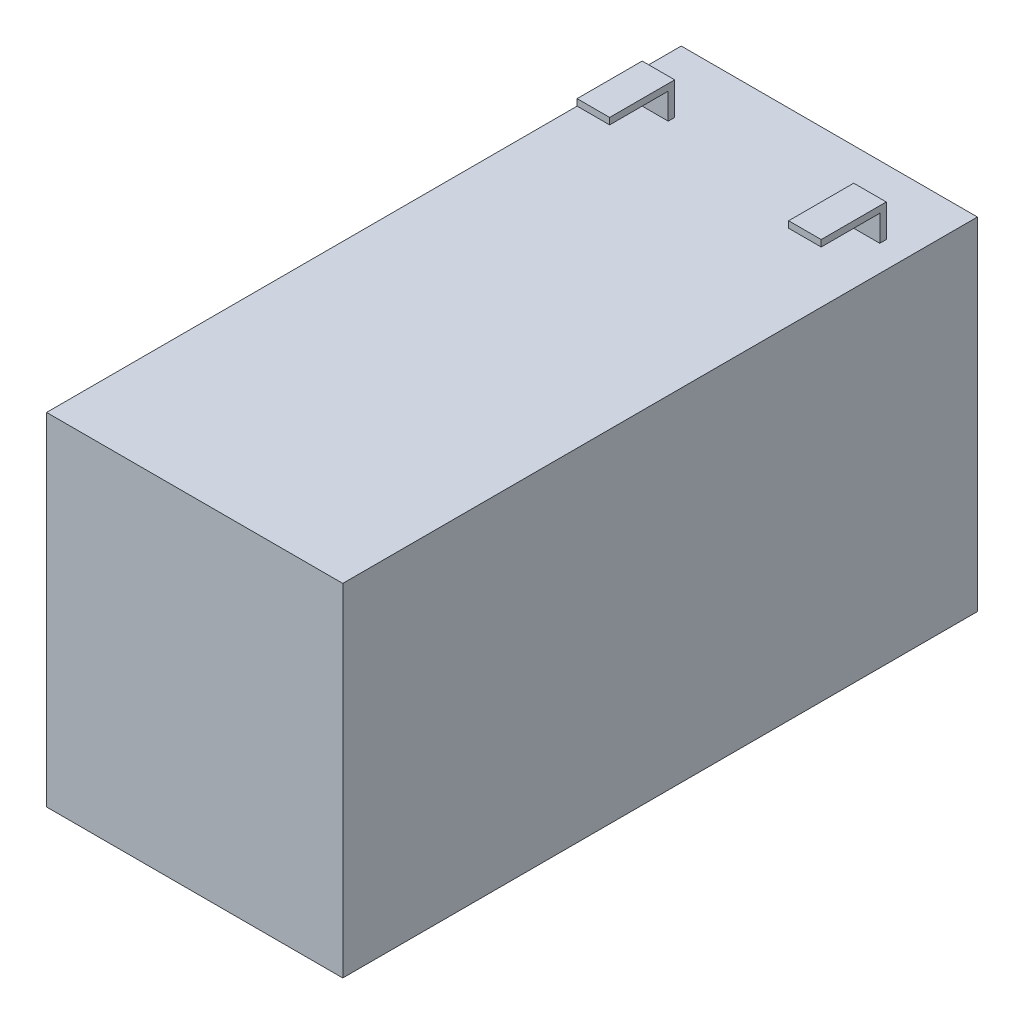
ISO-10303-21;
HEADER;
FILE_DESCRIPTION(('STEP AP214'),'2;1');
FILE_NAME('part.step','',(''),(''),'','','');
FILE_SCHEMA(('AUTOMOTIVE_DESIGN { 1 0 10303 214 1 1 1 1 }'));
ENDSEC;
DATA;
#1=APPLICATION_CONTEXT('core data for automotive mechanical design processes');
#2=APPLICATION_PROTOCOL_DEFINITION('international standard','automotive_design',2000,#1);
#3=PRODUCT_CONTEXT('',#1,'mechanical');
#4=PRODUCT('Part','Part','',(#3));
#5=PRODUCT_RELATED_PRODUCT_CATEGORY('part','',(#4));
#6=PRODUCT_DEFINITION_FORMATION('','',#4);
#7=PRODUCT_DEFINITION_CONTEXT('part definition',#1,'design');
#8=PRODUCT_DEFINITION('design','',#6,#7);
#9=PRODUCT_DEFINITION_SHAPE('','',#8);
#10=(LENGTH_UNIT() NAMED_UNIT(*) SI_UNIT(.MILLI.,.METRE.));
#11=(NAMED_UNIT(*) PLANE_ANGLE_UNIT() SI_UNIT($,.RADIAN.));
#12=(NAMED_UNIT(*) SI_UNIT($,.STERADIAN.) SOLID_ANGLE_UNIT());
#13=UNCERTAINTY_MEASURE_WITH_UNIT(LENGTH_MEASURE(1.E-05),#10,'distance_accuracy_value','');
#14=(GEOMETRIC_REPRESENTATION_CONTEXT(3) GLOBAL_UNCERTAINTY_ASSIGNED_CONTEXT((#13)) GLOBAL_UNIT_ASSIGNED_CONTEXT((#10,
#11,#12)) REPRESENTATION_CONTEXT('',''));
#15=CARTESIAN_POINT('',(0.,0.,0.));
#16=DIRECTION('',(0.,0.,1.));
#17=DIRECTION('',(1.,0.,0.));
#18=AXIS2_PLACEMENT_3D('',#15,#16,#17);
#19=CARTESIAN_POINT('',(-22.75,52.5,-48.75));
#20=DIRECTION('',(0.,-1.,0.));
#21=DIRECTION('',(0.,0.,-1.));
#22=AXIS2_PLACEMENT_3D('',#19,#20,#21);
#23=PLANE('',#22);
#24=DIRECTION('',(1.,0.,0.));
#25=VECTOR('',#24,1.);
#26=CARTESIAN_POINT('',(18.75,52.5,-38.75));
#27=LINE('',#26,#25);
#28=CARTESIAN_POINT('',(13.75,52.5,-38.75));
#29=VERTEX_POINT('',#28);
#30=CARTESIAN_POINT('',(18.75,52.5,-38.75));
#31=VERTEX_POINT('',#30);
#32=EDGE_CURVE('E166',#29,#31,#27,.T.);
#33=ORIENTED_EDGE('',*,*,#32,.T.);
#34=DIRECTION('',(0.,0.,1.));
#35=VECTOR('',#34,1.);
#36=CARTESIAN_POINT('',(18.75,52.5,-38.75));
#37=LINE('',#36,#35);
#38=CARTESIAN_POINT('',(18.75,52.5,-37.75));
#39=VERTEX_POINT('',#38);
#40=EDGE_CURVE('E50',#31,#39,#37,.T.);
#41=ORIENTED_EDGE('',*,*,#40,.T.);
#42=DIRECTION('',(-1.,0.,0.));
#43=VECTOR('',#42,1.);
#44=CARTESIAN_POINT('',(18.75,52.5,-37.75));
#45=LINE('',#44,#43);
#46=CARTESIAN_POINT('',(13.75,52.5,-37.75));
#47=VERTEX_POINT('',#46);
#48=EDGE_CURVE('E172',#39,#47,#45,.T.);
#49=ORIENTED_EDGE('',*,*,#48,.T.);
#50=DIRECTION('',(0.,0.,-1.));
#51=VECTOR('',#50,1.);
#52=CARTESIAN_POINT('',(13.75,52.5,-38.75));
#53=LINE('',#52,#51);
#54=EDGE_CURVE('E154',#47,#29,#53,.T.);
#55=ORIENTED_EDGE('',*,*,#54,.T.);
#56=EDGE_LOOP('',(#33,#41,#49,#55));
#57=FACE_BOUND('',#56,.T.);
#58=DIRECTION('',(0.,0.,1.));
#59=VECTOR('',#58,1.);
#60=CARTESIAN_POINT('',(-22.75,52.5,48.75));
#61=LINE('',#60,#59);
#62=CARTESIAN_POINT('',(-22.75,52.5,-48.75));
#63=VERTEX_POINT('',#62);
#64=CARTESIAN_POINT('',(-22.75,52.5,48.75));
#65=VERTEX_POINT('',#64);
#66=EDGE_CURVE('E249',#63,#65,#61,.T.);
#67=ORIENTED_EDGE('',*,*,#66,.T.);
#68=DIRECTION('',(1.,0.,0.));
#69=VECTOR('',#68,1.);
#70=CARTESIAN_POINT('',(-22.75,52.5,48.75));
#71=LINE('',#70,#69);
#72=CARTESIAN_POINT('',(22.75,52.5,48.75));
#73=VERTEX_POINT('',#72);
#74=EDGE_CURVE('E252',#65,#73,#71,.T.);
#75=ORIENTED_EDGE('',*,*,#74,.T.);
#76=DIRECTION('',(0.,0.,-1.));
#77=VECTOR('',#76,1.);
#78=CARTESIAN_POINT('',(22.75,52.5,48.75));
#79=LINE('',#78,#77);
#80=CARTESIAN_POINT('',(22.75,52.5,-48.75));
#81=VERTEX_POINT('',#80);
#82=EDGE_CURVE('E255',#73,#81,#79,.T.);
#83=ORIENTED_EDGE('',*,*,#82,.T.);
#84=DIRECTION('',(-1.,0.,0.));
#85=VECTOR('',#84,1.);
#86=CARTESIAN_POINT('',(-22.75,52.5,-48.75));
#87=LINE('',#86,#85);
#88=EDGE_CURVE('E257',#81,#63,#87,.T.);
#89=ORIENTED_EDGE('',*,*,#88,.T.);
#90=EDGE_LOOP('',(#67,#75,#83,#89));
#91=FACE_BOUND('',#90,.T.);
#92=DIRECTION('',(-1.,0.,0.));
#93=VECTOR('',#92,1.);
#94=CARTESIAN_POINT('',(-18.75,52.5,-38.75));
#95=LINE('',#94,#93);
#96=CARTESIAN_POINT('',(-13.75,52.5,-38.75));
#97=VERTEX_POINT('',#96);
#98=CARTESIAN_POINT('',(-18.75,52.5,-38.75));
#99=VERTEX_POINT('',#98);
#100=EDGE_CURVE('E58',#97,#99,#95,.T.);
#101=ORIENTED_EDGE('',*,*,#100,.F.);
#102=DIRECTION('',(0.,0.,-1.));
#103=VECTOR('',#102,1.);
#104=CARTESIAN_POINT('',(-13.75,52.5,-38.75));
#105=LINE('',#104,#103);
#106=CARTESIAN_POINT('',(-13.75,52.5,-37.75));
#107=VERTEX_POINT('',#106);
#108=EDGE_CURVE('E222',#107,#97,#105,.T.);
#109=ORIENTED_EDGE('',*,*,#108,.F.);
#110=DIRECTION('',(1.,0.,0.));
#111=VECTOR('',#110,1.);
#112=CARTESIAN_POINT('',(-18.75,52.5,-37.75));
#113=LINE('',#112,#111);
#114=CARTESIAN_POINT('',(-18.75,52.5,-37.75));
#115=VERTEX_POINT('',#114);
#116=EDGE_CURVE('E219',#115,#107,#113,.T.);
#117=ORIENTED_EDGE('',*,*,#116,.F.);
#118=DIRECTION('',(0.,0.,1.));
#119=VECTOR('',#118,1.);
#120=CARTESIAN_POINT('',(-18.75,52.5,-38.75));
#121=LINE('',#120,#119);
#122=EDGE_CURVE('E196',#99,#115,#121,.T.);
#123=ORIENTED_EDGE('',*,*,#122,.F.);
#124=EDGE_LOOP('',(#101,#109,#117,#123));
#125=FACE_BOUND('',#124,.T.);
#126=ADVANCED_FACE('F35',(#57,#91,#125),#23,.F.);
#127=CARTESIAN_POINT('',(-22.75,52.5,48.75));
#128=DIRECTION('',(1.,0.,0.));
#129=DIRECTION('',(0.,0.,-1.));
#130=AXIS2_PLACEMENT_3D('',#127,#128,#129);
#131=PLANE('',#130);
#132=DIRECTION('',(0.,0.,1.));
#133=VECTOR('',#132,1.);
#134=CARTESIAN_POINT('',(-22.75,0.,48.75));
#135=LINE('',#134,#133);
#136=CARTESIAN_POINT('',(-22.75,0.,-48.75));
#137=VERTEX_POINT('',#136);
#138=CARTESIAN_POINT('',(-22.75,0.,48.75));
#139=VERTEX_POINT('',#138);
#140=EDGE_CURVE('E201',#137,#139,#135,.T.);
#141=ORIENTED_EDGE('',*,*,#140,.T.);
#142=DIRECTION('',(0.,-1.,0.));
#143=VECTOR('',#142,1.);
#144=CARTESIAN_POINT('',(-22.75,52.5,48.75));
#145=LINE('',#144,#143);
#146=EDGE_CURVE('E12',#65,#139,#145,.T.);
#147=ORIENTED_EDGE('',*,*,#146,.F.);
#148=ORIENTED_EDGE('',*,*,#66,.F.);
#149=DIRECTION('',(0.,-1.,0.));
#150=VECTOR('',#149,1.);
#151=CARTESIAN_POINT('',(-22.75,52.5,-48.75));
#152=LINE('',#151,#150);
#153=EDGE_CURVE('E259',#63,#137,#152,.T.);
#154=ORIENTED_EDGE('',*,*,#153,.T.);
#155=EDGE_LOOP('',(#141,#147,#148,#154));
#156=FACE_BOUND('',#155,.T.);
#157=ADVANCED_FACE('F37',(#156),#131,.F.);
#158=CARTESIAN_POINT('',(-22.75,52.5,48.75));
#159=DIRECTION('',(0.,0.,-1.));
#160=DIRECTION('',(-1.,0.,0.));
#161=AXIS2_PLACEMENT_3D('',#158,#159,#160);
#162=PLANE('',#161);
#163=DIRECTION('',(1.,0.,0.));
#164=VECTOR('',#163,1.);
#165=CARTESIAN_POINT('',(-22.75,0.,48.75));
#166=LINE('',#165,#164);
#167=CARTESIAN_POINT('',(22.75,0.,48.75));
#168=VERTEX_POINT('',#167);
#169=EDGE_CURVE('E262',#139,#168,#166,.T.);
#170=ORIENTED_EDGE('',*,*,#169,.T.);
#171=DIRECTION('',(0.,-1.,0.));
#172=VECTOR('',#171,1.);
#173=CARTESIAN_POINT('',(22.75,52.5,48.75));
#174=LINE('',#173,#172);
#175=EDGE_CURVE('E43',#73,#168,#174,.T.);
#176=ORIENTED_EDGE('',*,*,#175,.F.);
#177=ORIENTED_EDGE('',*,*,#74,.F.);
#178=ORIENTED_EDGE('',*,*,#146,.T.);
#179=EDGE_LOOP('',(#170,#176,#177,#178));
#180=FACE_BOUND('',#179,.T.);
#181=ADVANCED_FACE('F290',(#180),#162,.F.);
#182=CARTESIAN_POINT('',(22.75,52.5,48.75));
#183=DIRECTION('',(-1.,0.,0.));
#184=DIRECTION('',(0.,0.,1.));
#185=AXIS2_PLACEMENT_3D('',#182,#183,#184);
#186=PLANE('',#185);
#187=DIRECTION('',(0.,0.,-1.));
#188=VECTOR('',#187,1.);
#189=CARTESIAN_POINT('',(22.75,0.,48.75));
#190=LINE('',#189,#188);
#191=CARTESIAN_POINT('',(22.75,0.,-48.75));
#192=VERTEX_POINT('',#191);
#193=EDGE_CURVE('E264',#168,#192,#190,.T.);
#194=ORIENTED_EDGE('',*,*,#193,.T.);
#195=DIRECTION('',(0.,-1.,0.));
#196=VECTOR('',#195,1.);
#197=CARTESIAN_POINT('',(22.75,52.5,-48.75));
#198=LINE('',#197,#196);
#199=EDGE_CURVE('E269',#81,#192,#198,.T.);
#200=ORIENTED_EDGE('',*,*,#199,.F.);
#201=ORIENTED_EDGE('',*,*,#82,.F.);
#202=ORIENTED_EDGE('',*,*,#175,.T.);
#203=EDGE_LOOP('',(#194,#200,#201,#202));
#204=FACE_BOUND('',#203,.T.);
#205=ADVANCED_FACE('F276',(#204),#186,.F.);
#206=CARTESIAN_POINT('',(-22.75,52.5,-48.75));
#207=DIRECTION('',(0.,0.,1.));
#208=DIRECTION('',(1.,0.,0.));
#209=AXIS2_PLACEMENT_3D('',#206,#207,#208);
#210=PLANE('',#209);
#211=DIRECTION('',(-1.,0.,0.));
#212=VECTOR('',#211,1.);
#213=CARTESIAN_POINT('',(-22.75,0.,-48.75));
#214=LINE('',#213,#212);
#215=EDGE_CURVE('E253',#192,#137,#214,.T.);
#216=ORIENTED_EDGE('',*,*,#215,.T.);
#217=ORIENTED_EDGE('',*,*,#153,.F.);
#218=ORIENTED_EDGE('',*,*,#88,.F.);
#219=ORIENTED_EDGE('',*,*,#199,.T.);
#220=EDGE_LOOP('',(#216,#217,#218,#219));
#221=FACE_BOUND('',#220,.T.);
#222=ADVANCED_FACE('F285',(#221),#210,.F.);
#223=CARTESIAN_POINT('',(-22.75,0.,-48.75));
#224=DIRECTION('',(0.,-1.,0.));
#225=DIRECTION('',(0.,0.,-1.));
#226=AXIS2_PLACEMENT_3D('',#223,#224,#225);
#227=PLANE('',#226);
#228=ORIENTED_EDGE('',*,*,#140,.F.);
#229=ORIENTED_EDGE('',*,*,#215,.F.);
#230=ORIENTED_EDGE('',*,*,#193,.F.);
#231=ORIENTED_EDGE('',*,*,#169,.F.);
#232=EDGE_LOOP('',(#228,#229,#230,#231));
#233=FACE_BOUND('',#232,.T.);
#234=ADVANCED_FACE('F282',(#233),#227,.T.);
#235=CARTESIAN_POINT('',(-18.75,57.5,-38.75));
#236=DIRECTION('',(0.,1.,0.));
#237=DIRECTION('',(0.,0.,1.));
#238=AXIS2_PLACEMENT_3D('',#235,#236,#237);
#239=PLANE('',#238);
#240=DIRECTION('',(0.,0.,1.));
#241=VECTOR('',#240,1.);
#242=CARTESIAN_POINT('',(-18.75,57.5,-38.75));
#243=LINE('',#242,#241);
#244=CARTESIAN_POINT('',(-18.75,57.5,-38.75));
#245=VERTEX_POINT('',#244);
#246=CARTESIAN_POINT('',(-18.75,57.5,-28.75));
#247=VERTEX_POINT('',#246);
#248=EDGE_CURVE('E244',#245,#247,#243,.T.);
#249=ORIENTED_EDGE('',*,*,#248,.T.);
#250=DIRECTION('',(1.,0.,0.));
#251=VECTOR('',#250,1.);
#252=CARTESIAN_POINT('',(-18.75,57.5,-28.75));
#253=LINE('',#252,#251);
#254=CARTESIAN_POINT('',(-13.75,57.5,-28.75));
#255=VERTEX_POINT('',#254);
#256=EDGE_CURVE('E205',#247,#255,#253,.T.);
#257=ORIENTED_EDGE('',*,*,#256,.T.);
#258=DIRECTION('',(0.,0.,1.));
#259=VECTOR('',#258,1.);
#260=CARTESIAN_POINT('',(-13.75,57.5,-38.75));
#261=LINE('',#260,#259);
#262=CARTESIAN_POINT('',(-13.75,57.5,-38.75));
#263=VERTEX_POINT('',#262);
#264=EDGE_CURVE('E216',#263,#255,#261,.T.);
#265=ORIENTED_EDGE('',*,*,#264,.F.);
#266=DIRECTION('',(-1.,0.,0.));
#267=VECTOR('',#266,1.);
#268=CARTESIAN_POINT('',(-18.75,57.5,-38.75));
#269=LINE('',#268,#267);
#270=EDGE_CURVE('E212',#263,#245,#269,.T.);
#271=ORIENTED_EDGE('',*,*,#270,.T.);
#272=EDGE_LOOP('',(#249,#257,#265,#271));
#273=FACE_BOUND('',#272,.T.);
#274=ADVANCED_FACE('F307',(#273),#239,.T.);
#275=CARTESIAN_POINT('',(-18.75,56.5,-37.75));
#276=DIRECTION('',(0.,-1.,0.));
#277=DIRECTION('',(0.,0.,-1.));
#278=AXIS2_PLACEMENT_3D('',#275,#276,#277);
#279=PLANE('',#278);
#280=DIRECTION('',(0.,0.,1.));
#281=VECTOR('',#280,1.);
#282=CARTESIAN_POINT('',(-13.75,56.5,-37.75));
#283=LINE('',#282,#281);
#284=CARTESIAN_POINT('',(-13.75,56.5,-37.75));
#285=VERTEX_POINT('',#284);
#286=CARTESIAN_POINT('',(-13.75,56.5,-28.75));
#287=VERTEX_POINT('',#286);
#288=EDGE_CURVE('E238',#285,#287,#283,.T.);
#289=ORIENTED_EDGE('',*,*,#288,.T.);
#290=DIRECTION('',(-1.,0.,0.));
#291=VECTOR('',#290,1.);
#292=CARTESIAN_POINT('',(-18.75,56.5,-28.75));
#293=LINE('',#292,#291);
#294=CARTESIAN_POINT('',(-18.75,56.5,-28.75));
#295=VERTEX_POINT('',#294);
#296=EDGE_CURVE('E198',#287,#295,#293,.T.);
#297=ORIENTED_EDGE('',*,*,#296,.T.);
#298=DIRECTION('',(0.,0.,1.));
#299=VECTOR('',#298,1.);
#300=CARTESIAN_POINT('',(-18.75,56.5,-37.75));
#301=LINE('',#300,#299);
#302=CARTESIAN_POINT('',(-18.75,56.5,-37.75));
#303=VERTEX_POINT('',#302);
#304=EDGE_CURVE('E241',#303,#295,#301,.T.);
#305=ORIENTED_EDGE('',*,*,#304,.F.);
#306=DIRECTION('',(1.,0.,0.));
#307=VECTOR('',#306,1.);
#308=CARTESIAN_POINT('',(-18.75,56.5,-37.75));
#309=LINE('',#308,#307);
#310=EDGE_CURVE('E209',#303,#285,#309,.T.);
#311=ORIENTED_EDGE('',*,*,#310,.T.);
#312=EDGE_LOOP('',(#289,#297,#305,#311));
#313=FACE_BOUND('',#312,.T.);
#314=ADVANCED_FACE('F303',(#313),#279,.T.);
#315=CARTESIAN_POINT('',(-18.75,62.0990195135928,-38.75));
#316=DIRECTION('',(0.,0.,1.));
#317=DIRECTION('',(1.,0.,0.));
#318=AXIS2_PLACEMENT_3D('',#315,#316,#317);
#319=PLANE('',#318);
#320=ORIENTED_EDGE('',*,*,#270,.F.);
#321=DIRECTION('',(0.,-1.,0.));
#322=VECTOR('',#321,1.);
#323=CARTESIAN_POINT('',(-13.75,62.0990195135928,-38.75));
#324=LINE('',#323,#322);
#325=EDGE_CURVE('E229',#263,#97,#324,.T.);
#326=ORIENTED_EDGE('',*,*,#325,.T.);
#327=ORIENTED_EDGE('',*,*,#100,.T.);
#328=DIRECTION('',(0.,-1.,0.));
#329=VECTOR('',#328,1.);
#330=CARTESIAN_POINT('',(-18.75,62.0990195135928,-38.75));
#331=LINE('',#330,#329);
#332=EDGE_CURVE('E226',#245,#99,#331,.T.);
#333=ORIENTED_EDGE('',*,*,#332,.F.);
#334=EDGE_LOOP('',(#320,#326,#327,#333));
#335=FACE_BOUND('',#334,.T.);
#336=ADVANCED_FACE('F329',(#335),#319,.F.);
#337=CARTESIAN_POINT('',(-13.75,62.0990195135928,-38.75));
#338=DIRECTION('',(-1.,0.,0.));
#339=DIRECTION('',(0.,0.,1.));
#340=AXIS2_PLACEMENT_3D('',#337,#338,#339);
#341=PLANE('',#340);
#342=ORIENTED_EDGE('',*,*,#325,.F.);
#343=ORIENTED_EDGE('',*,*,#264,.T.);
#344=DIRECTION('',(0.,-1.,0.));
#345=VECTOR('',#344,1.);
#346=CARTESIAN_POINT('',(-13.75,59.7995097567964,-28.75));
#347=LINE('',#346,#345);
#348=EDGE_CURVE('E202',#255,#287,#347,.T.);
#349=ORIENTED_EDGE('',*,*,#348,.T.);
#350=ORIENTED_EDGE('',*,*,#288,.F.);
#351=DIRECTION('',(0.,-1.,0.));
#352=VECTOR('',#351,1.);
#353=CARTESIAN_POINT('',(-13.75,62.0990195135928,-37.75));
#354=LINE('',#353,#352);
#355=EDGE_CURVE('E231',#285,#107,#354,.T.);
#356=ORIENTED_EDGE('',*,*,#355,.T.);
#357=ORIENTED_EDGE('',*,*,#108,.T.);
#358=EDGE_LOOP('',(#342,#343,#349,#350,#356,#357));
#359=FACE_BOUND('',#358,.T.);
#360=ADVANCED_FACE('F336',(#359),#341,.F.);
#361=CARTESIAN_POINT('',(-18.75,62.0990195135928,-37.75));
#362=DIRECTION('',(0.,0.,-1.));
#363=DIRECTION('',(-1.,0.,0.));
#364=AXIS2_PLACEMENT_3D('',#361,#362,#363);
#365=PLANE('',#364);
#366=ORIENTED_EDGE('',*,*,#310,.F.);
#367=DIRECTION('',(0.,-1.,0.));
#368=VECTOR('',#367,1.);
#369=CARTESIAN_POINT('',(-18.75,62.0990195135928,-37.75));
#370=LINE('',#369,#368);
#371=EDGE_CURVE('E213',#303,#115,#370,.T.);
#372=ORIENTED_EDGE('',*,*,#371,.T.);
#373=ORIENTED_EDGE('',*,*,#116,.T.);
#374=ORIENTED_EDGE('',*,*,#355,.F.);
#375=EDGE_LOOP('',(#366,#372,#373,#374));
#376=FACE_BOUND('',#375,.T.);
#377=ADVANCED_FACE('F344',(#376),#365,.F.);
#378=CARTESIAN_POINT('',(-18.75,62.0990195135928,-38.75));
#379=DIRECTION('',(1.,0.,0.));
#380=DIRECTION('',(0.,0.,-1.));
#381=AXIS2_PLACEMENT_3D('',#378,#379,#380);
#382=PLANE('',#381);
#383=ORIENTED_EDGE('',*,*,#371,.F.);
#384=ORIENTED_EDGE('',*,*,#304,.T.);
#385=DIRECTION('',(0.,1.,0.));
#386=VECTOR('',#385,1.);
#387=CARTESIAN_POINT('',(-18.75,59.7995097567964,-28.75));
#388=LINE('',#387,#386);
#389=EDGE_CURVE('E208',#295,#247,#388,.T.);
#390=ORIENTED_EDGE('',*,*,#389,.T.);
#391=ORIENTED_EDGE('',*,*,#248,.F.);
#392=ORIENTED_EDGE('',*,*,#332,.T.);
#393=ORIENTED_EDGE('',*,*,#122,.T.);
#394=EDGE_LOOP('',(#383,#384,#390,#391,#392,#393));
#395=FACE_BOUND('',#394,.T.);
#396=ADVANCED_FACE('F352',(#395),#382,.F.);
#397=CARTESIAN_POINT('',(-16.25,57.,-28.75));
#398=DIRECTION('',(0.,0.,1.));
#399=DIRECTION('',(1.,0.,0.));
#400=AXIS2_PLACEMENT_3D('',#397,#398,#399);
#401=PLANE('',#400);
#402=ORIENTED_EDGE('',*,*,#389,.F.);
#403=ORIENTED_EDGE('',*,*,#296,.F.);
#404=ORIENTED_EDGE('',*,*,#348,.F.);
#405=ORIENTED_EDGE('',*,*,#256,.F.);
#406=EDGE_LOOP('',(#402,#403,#404,#405));
#407=FACE_BOUND('',#406,.T.);
#408=ADVANCED_FACE('F360',(#407),#401,.T.);
#409=CARTESIAN_POINT('',(18.75,57.5,-38.75));
#410=DIRECTION('',(0.,-1.,0.));
#411=DIRECTION('',(0.,0.,-1.));
#412=AXIS2_PLACEMENT_3D('',#409,#410,#411);
#413=PLANE('',#412);
#414=DIRECTION('',(-1.,0.,0.));
#415=VECTOR('',#414,1.);
#416=CARTESIAN_POINT('',(18.75,57.5,-28.75));
#417=LINE('',#416,#415);
#418=CARTESIAN_POINT('',(18.75,57.5,-28.75));
#419=VERTEX_POINT('',#418);
#420=CARTESIAN_POINT('',(13.75,57.5,-28.75));
#421=VERTEX_POINT('',#420);
#422=EDGE_CURVE('E487',#419,#421,#417,.T.);
#423=ORIENTED_EDGE('',*,*,#422,.F.);
#424=DIRECTION('',(0.,0.,1.));
#425=VECTOR('',#424,1.);
#426=CARTESIAN_POINT('',(18.75,57.5,-38.75));
#427=LINE('',#426,#425);
#428=CARTESIAN_POINT('',(18.75,57.5,-38.75));
#429=VERTEX_POINT('',#428);
#430=EDGE_CURVE('E183',#429,#419,#427,.T.);
#431=ORIENTED_EDGE('',*,*,#430,.F.);
#432=DIRECTION('',(1.,0.,0.));
#433=VECTOR('',#432,1.);
#434=CARTESIAN_POINT('',(18.75,57.5,-38.75));
#435=LINE('',#434,#433);
#436=CARTESIAN_POINT('',(13.75,57.5,-38.75));
#437=VERTEX_POINT('',#436);
#438=EDGE_CURVE('E184',#437,#429,#435,.T.);
#439=ORIENTED_EDGE('',*,*,#438,.F.);
#440=DIRECTION('',(0.,0.,1.));
#441=VECTOR('',#440,1.);
#442=CARTESIAN_POINT('',(13.75,57.5,-38.75));
#443=LINE('',#442,#441);
#444=EDGE_CURVE('E158',#437,#421,#443,.T.);
#445=ORIENTED_EDGE('',*,*,#444,.T.);
#446=EDGE_LOOP('',(#423,#431,#439,#445));
#447=FACE_BOUND('',#446,.T.);
#448=ADVANCED_FACE('F368',(#447),#413,.F.);
#449=CARTESIAN_POINT('',(18.75,56.5,-37.75));
#450=DIRECTION('',(0.,1.,0.));
#451=DIRECTION('',(0.,0.,1.));
#452=AXIS2_PLACEMENT_3D('',#449,#450,#451);
#453=PLANE('',#452);
#454=DIRECTION('',(1.,0.,0.));
#455=VECTOR('',#454,1.);
#456=CARTESIAN_POINT('',(18.75,56.5,-28.75));
#457=LINE('',#456,#455);
#458=CARTESIAN_POINT('',(13.75,56.5,-28.75));
#459=VERTEX_POINT('',#458);
#460=CARTESIAN_POINT('',(18.75,56.5,-28.75));
#461=VERTEX_POINT('',#460);
#462=EDGE_CURVE('E194',#459,#461,#457,.T.);
#463=ORIENTED_EDGE('',*,*,#462,.F.);
#464=DIRECTION('',(0.,0.,1.));
#465=VECTOR('',#464,1.);
#466=CARTESIAN_POINT('',(13.75,56.5,-37.75));
#467=LINE('',#466,#465);
#468=CARTESIAN_POINT('',(13.75,56.5,-37.75));
#469=VERTEX_POINT('',#468);
#470=EDGE_CURVE('E190',#469,#459,#467,.T.);
#471=ORIENTED_EDGE('',*,*,#470,.F.);
#472=DIRECTION('',(-1.,0.,0.));
#473=VECTOR('',#472,1.);
#474=CARTESIAN_POINT('',(18.75,56.5,-37.75));
#475=LINE('',#474,#473);
#476=CARTESIAN_POINT('',(18.75,56.5,-37.75));
#477=VERTEX_POINT('',#476);
#478=EDGE_CURVE('E181',#477,#469,#475,.T.);
#479=ORIENTED_EDGE('',*,*,#478,.F.);
#480=DIRECTION('',(0.,0.,1.));
#481=VECTOR('',#480,1.);
#482=CARTESIAN_POINT('',(18.75,56.5,-37.75));
#483=LINE('',#482,#481);
#484=EDGE_CURVE('E187',#477,#461,#483,.T.);
#485=ORIENTED_EDGE('',*,*,#484,.T.);
#486=EDGE_LOOP('',(#463,#471,#479,#485));
#487=FACE_BOUND('',#486,.T.);
#488=ADVANCED_FACE('F376',(#487),#453,.F.);
#489=CARTESIAN_POINT('',(18.75,62.0990195135928,-38.75));
#490=DIRECTION('',(1.,0.,0.));
#491=DIRECTION('',(0.,0.,-1.));
#492=AXIS2_PLACEMENT_3D('',#489,#490,#491);
#493=PLANE('',#492);
#494=DIRECTION('',(0.,-1.,0.));
#495=VECTOR('',#494,1.);
#496=CARTESIAN_POINT('',(18.75,62.0990195135928,-38.75));
#497=LINE('',#496,#495);
#498=EDGE_CURVE('E162',#429,#31,#497,.T.);
#499=ORIENTED_EDGE('',*,*,#498,.F.);
#500=ORIENTED_EDGE('',*,*,#430,.T.);
#501=DIRECTION('',(0.,1.,0.));
#502=VECTOR('',#501,1.);
#503=CARTESIAN_POINT('',(18.75,59.7995097567964,-28.75));
#504=LINE('',#503,#502);
#505=EDGE_CURVE('E193',#461,#419,#504,.T.);
#506=ORIENTED_EDGE('',*,*,#505,.F.);
#507=ORIENTED_EDGE('',*,*,#484,.F.);
#508=DIRECTION('',(0.,-1.,0.));
#509=VECTOR('',#508,1.);
#510=CARTESIAN_POINT('',(18.75,62.0990195135928,-37.75));
#511=LINE('',#510,#509);
#512=EDGE_CURVE('E174',#477,#39,#511,.T.);
#513=ORIENTED_EDGE('',*,*,#512,.T.);
#514=ORIENTED_EDGE('',*,*,#40,.F.);
#515=EDGE_LOOP('',(#499,#500,#506,#507,#513,#514));
#516=FACE_BOUND('',#515,.T.);
#517=ADVANCED_FACE('F384',(#516),#493,.T.);
#518=CARTESIAN_POINT('',(18.75,62.0990195135928,-37.75));
#519=DIRECTION('',(0.,0.,1.));
#520=DIRECTION('',(1.,0.,0.));
#521=AXIS2_PLACEMENT_3D('',#518,#519,#520);
#522=PLANE('',#521);
#523=ORIENTED_EDGE('',*,*,#512,.F.);
#524=ORIENTED_EDGE('',*,*,#478,.T.);
#525=DIRECTION('',(0.,-1.,0.));
#526=VECTOR('',#525,1.);
#527=CARTESIAN_POINT('',(13.75,62.0990195135928,-37.75));
#528=LINE('',#527,#526);
#529=EDGE_CURVE('E163',#469,#47,#528,.T.);
#530=ORIENTED_EDGE('',*,*,#529,.T.);
#531=ORIENTED_EDGE('',*,*,#48,.F.);
#532=EDGE_LOOP('',(#523,#524,#530,#531));
#533=FACE_BOUND('',#532,.T.);
#534=ADVANCED_FACE('F392',(#533),#522,.T.);
#535=CARTESIAN_POINT('',(13.75,62.0990195135928,-38.75));
#536=DIRECTION('',(-1.,0.,0.));
#537=DIRECTION('',(0.,0.,1.));
#538=AXIS2_PLACEMENT_3D('',#535,#536,#537);
#539=PLANE('',#538);
#540=ORIENTED_EDGE('',*,*,#529,.F.);
#541=ORIENTED_EDGE('',*,*,#470,.T.);
#542=DIRECTION('',(0.,-1.,0.));
#543=VECTOR('',#542,1.);
#544=CARTESIAN_POINT('',(13.75,59.7995097567964,-28.75));
#545=LINE('',#544,#543);
#546=EDGE_CURVE('E197',#421,#459,#545,.T.);
#547=ORIENTED_EDGE('',*,*,#546,.F.);
#548=ORIENTED_EDGE('',*,*,#444,.F.);
#549=DIRECTION('',(0.,-1.,0.));
#550=VECTOR('',#549,1.);
#551=CARTESIAN_POINT('',(13.75,62.0990195135928,-38.75));
#552=LINE('',#551,#550);
#553=EDGE_CURVE('E149',#437,#29,#552,.T.);
#554=ORIENTED_EDGE('',*,*,#553,.T.);
#555=ORIENTED_EDGE('',*,*,#54,.F.);
#556=EDGE_LOOP('',(#540,#541,#547,#548,#554,#555));
#557=FACE_BOUND('',#556,.T.);
#558=ADVANCED_FACE('F152',(#557),#539,.T.);
#559=CARTESIAN_POINT('',(18.75,62.0990195135928,-38.75));
#560=DIRECTION('',(0.,0.,-1.));
#561=DIRECTION('',(-1.,0.,0.));
#562=AXIS2_PLACEMENT_3D('',#559,#560,#561);
#563=PLANE('',#562);
#564=ORIENTED_EDGE('',*,*,#553,.F.);
#565=ORIENTED_EDGE('',*,*,#438,.T.);
#566=ORIENTED_EDGE('',*,*,#498,.T.);
#567=ORIENTED_EDGE('',*,*,#32,.F.);
#568=EDGE_LOOP('',(#564,#565,#566,#567));
#569=FACE_BOUND('',#568,.T.);
#570=ADVANCED_FACE('F167',(#569),#563,.T.);
#571=CARTESIAN_POINT('',(16.25,57.,-28.75));
#572=DIRECTION('',(0.,0.,1.));
#573=DIRECTION('',(1.,0.,0.));
#574=AXIS2_PLACEMENT_3D('',#571,#572,#573);
#575=PLANE('',#574);
#576=ORIENTED_EDGE('',*,*,#546,.T.);
#577=ORIENTED_EDGE('',*,*,#462,.T.);
#578=ORIENTED_EDGE('',*,*,#505,.T.);
#579=ORIENTED_EDGE('',*,*,#422,.T.);
#580=EDGE_LOOP('',(#576,#577,#578,#579));
#581=FACE_BOUND('',#580,.T.);
#582=ADVANCED_FACE('F412',(#581),#575,.T.);
#583=CLOSED_SHELL('',(#126,#157,#181,#205,#222,#234,#274,#314,#336,#360,#377,#396,#408,#448,
#488,#517,#534,#558,#570,#582));
#584=MANIFOLD_SOLID_BREP('B2',#583);
#585=ADVANCED_BREP_SHAPE_REPRESENTATION('',(#18,#584),#14);
#586=SHAPE_DEFINITION_REPRESENTATION(#9,#585);
ENDSEC;
END-ISO-10303-21;
